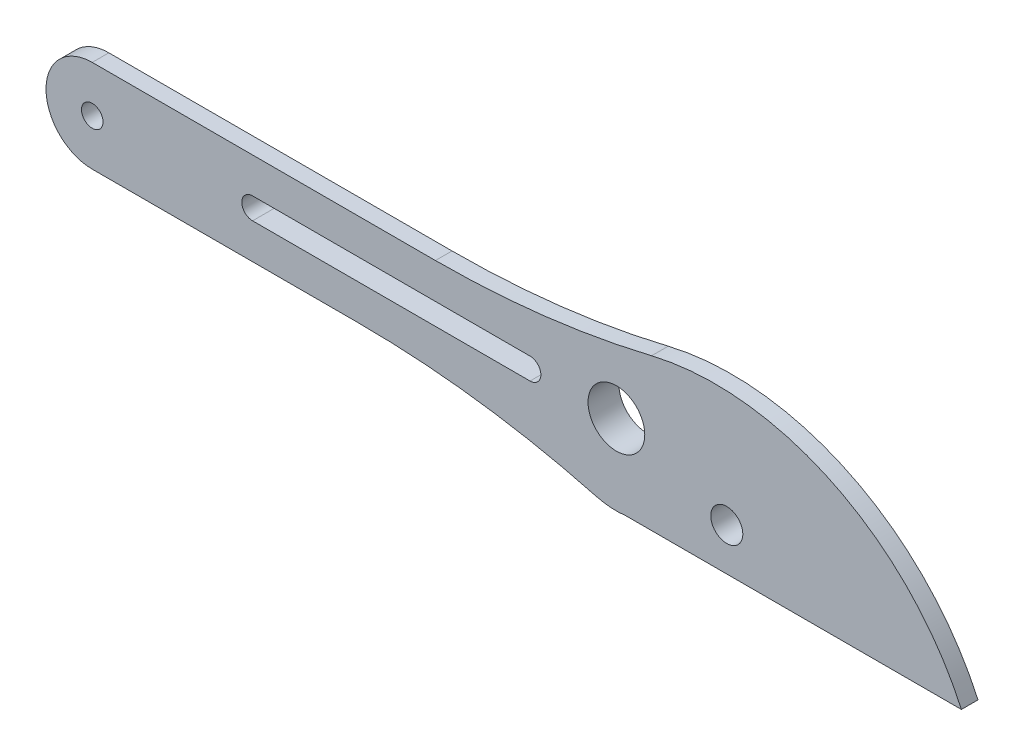
ISO-10303-21;
HEADER;
FILE_DESCRIPTION(('STEP AP214'),'2;1');
FILE_NAME('part.step','',(''),(''),'','','');
FILE_SCHEMA(('AUTOMOTIVE_DESIGN { 1 0 10303 214 1 1 1 1 }'));
ENDSEC;
DATA;
#1=APPLICATION_CONTEXT('core data for automotive mechanical design processes');
#2=APPLICATION_PROTOCOL_DEFINITION('international standard','automotive_design',2000,#1);
#3=PRODUCT_CONTEXT('',#1,'mechanical');
#4=PRODUCT('Part','Part','',(#3));
#5=PRODUCT_RELATED_PRODUCT_CATEGORY('part','',(#4));
#6=PRODUCT_DEFINITION_FORMATION('','',#4);
#7=PRODUCT_DEFINITION_CONTEXT('part definition',#1,'design');
#8=PRODUCT_DEFINITION('design','',#6,#7);
#9=PRODUCT_DEFINITION_SHAPE('','',#8);
#10=(LENGTH_UNIT() NAMED_UNIT(*) SI_UNIT(.MILLI.,.METRE.));
#11=(NAMED_UNIT(*) PLANE_ANGLE_UNIT() SI_UNIT($,.RADIAN.));
#12=(NAMED_UNIT(*) SI_UNIT($,.STERADIAN.) SOLID_ANGLE_UNIT());
#13=UNCERTAINTY_MEASURE_WITH_UNIT(LENGTH_MEASURE(1.E-05),#10,'distance_accuracy_value','');
#14=(GEOMETRIC_REPRESENTATION_CONTEXT(3) GLOBAL_UNCERTAINTY_ASSIGNED_CONTEXT((#13)) GLOBAL_UNIT_ASSIGNED_CONTEXT((#10,
#11,#12)) REPRESENTATION_CONTEXT('',''));
#15=CARTESIAN_POINT('',(0.,0.,0.));
#16=DIRECTION('',(0.,0.,1.));
#17=DIRECTION('',(1.,0.,0.));
#18=AXIS2_PLACEMENT_3D('',#15,#16,#17);
#19=CARTESIAN_POINT('',(0.,-7.5,5.));
#20=DIRECTION('',(0.,1.,0.));
#21=DIRECTION('',(0.,0.,1.));
#22=AXIS2_PLACEMENT_3D('',#19,#20,#21);
#23=PLANE('',#22);
#24=DIRECTION('',(0.,0.,-1.));
#25=VECTOR('',#24,1.);
#26=CARTESIAN_POINT('',(-26.,-7.5,5.));
#27=LINE('',#26,#25);
#28=CARTESIAN_POINT('',(-26.,-7.5,5.));
#29=VERTEX_POINT('',#28);
#30=CARTESIAN_POINT('',(-26.,-7.5,2.30940107675852));
#31=VERTEX_POINT('',#30);
#32=EDGE_CURVE('E231',#29,#31,#27,.T.);
#33=ORIENTED_EDGE('',*,*,#32,.T.);
#34=DIRECTION('',(1.,0.,0.));
#35=VECTOR('',#34,1.);
#36=CARTESIAN_POINT('',(0.,-7.5,2.30940107675852));
#37=LINE('',#36,#35);
#38=CARTESIAN_POINT('',(17.0148835895386,-7.5,2.30940107675852));
#39=VERTEX_POINT('',#38);
#40=EDGE_CURVE('E310',#31,#39,#37,.T.);
#41=ORIENTED_EDGE('',*,*,#40,.T.);
#42=DIRECTION('',(0.,0.,1.));
#43=VECTOR('',#42,1.);
#44=CARTESIAN_POINT('',(17.0148835895386,-7.5,5.));
#45=LINE('',#44,#43);
#46=CARTESIAN_POINT('',(17.0148835895386,-7.5,5.));
#47=VERTEX_POINT('',#46);
#48=EDGE_CURVE('E247',#39,#47,#45,.T.);
#49=ORIENTED_EDGE('',*,*,#48,.T.);
#50=DIRECTION('',(1.,0.,0.));
#51=VECTOR('',#50,1.);
#52=CARTESIAN_POINT('',(0.,-7.5,5.));
#53=LINE('',#52,#51);
#54=EDGE_CURVE('E206',#29,#47,#53,.T.);
#55=ORIENTED_EDGE('',*,*,#54,.F.);
#56=EDGE_LOOP('',(#33,#41,#49,#55));
#57=FACE_BOUND('',#56,.T.);
#58=ADVANCED_FACE('F43',(#57),#23,.F.);
#59=CARTESIAN_POINT('',(0.,7.5,5.));
#60=DIRECTION('',(0.,1.,0.));
#61=DIRECTION('',(0.,0.,1.));
#62=AXIS2_PLACEMENT_3D('',#59,#60,#61);
#63=PLANE('',#62);
#64=DIRECTION('',(0.,0.,1.));
#65=VECTOR('',#64,1.);
#66=CARTESIAN_POINT('',(29.6541070394529,7.5,5.));
#67=LINE('',#66,#65);
#68=CARTESIAN_POINT('',(29.6541070394529,7.5,5.));
#69=VERTEX_POINT('',#68);
#70=CARTESIAN_POINT('',(29.6541070394529,7.5,2.30940107675852));
#71=VERTEX_POINT('',#70);
#72=EDGE_CURVE('E245',#69,#71,#67,.F.);
#73=ORIENTED_EDGE('',*,*,#72,.T.);
#74=DIRECTION('',(-1.,0.,0.));
#75=VECTOR('',#74,1.);
#76=CARTESIAN_POINT('',(-26.,7.5,2.30940107675852));
#77=LINE('',#76,#75);
#78=CARTESIAN_POINT('',(-26.,7.5,2.30940107675852));
#79=VERTEX_POINT('',#78);
#80=EDGE_CURVE('E378',#71,#79,#77,.T.);
#81=ORIENTED_EDGE('',*,*,#80,.T.);
#82=DIRECTION('',(0.,0.,-1.));
#83=VECTOR('',#82,1.);
#84=CARTESIAN_POINT('',(-26.,7.5,5.));
#85=LINE('',#84,#83);
#86=CARTESIAN_POINT('',(-26.,7.5,5.));
#87=VERTEX_POINT('',#86);
#88=EDGE_CURVE('E234',#87,#79,#85,.T.);
#89=ORIENTED_EDGE('',*,*,#88,.F.);
#90=DIRECTION('',(1.,0.,0.));
#91=VECTOR('',#90,1.);
#92=CARTESIAN_POINT('',(0.,7.5,5.));
#93=LINE('',#92,#91);
#94=EDGE_CURVE('E209',#87,#69,#93,.T.);
#95=ORIENTED_EDGE('',*,*,#94,.T.);
#96=EDGE_LOOP('',(#73,#81,#89,#95));
#97=FACE_BOUND('',#96,.T.);
#98=ADVANCED_FACE('F330',(#97),#63,.T.);
#99=CARTESIAN_POINT('',(45.,0.,5.));
#100=DIRECTION('',(0.,0.,-1.));
#101=DIRECTION('',(-1.,0.,0.));
#102=AXIS2_PLACEMENT_3D('',#99,#100,#101);
#103=CYLINDRICAL_SURFACE('',#102,1.75);
#104=CARTESIAN_POINT('',(45.,0.,0.));
#105=DIRECTION('',(0.,0.,1.));
#106=DIRECTION('',(1.,0.,0.));
#107=AXIS2_PLACEMENT_3D('',#104,#105,#106);
#108=CIRCLE('',#107,1.75);
#109=CARTESIAN_POINT('',(45.,-1.75,0.));
#110=VERTEX_POINT('',#109);
#111=CARTESIAN_POINT('',(45.,1.75,0.));
#112=VERTEX_POINT('',#111);
#113=EDGE_CURVE('E220',#110,#112,#108,.T.);
#114=ORIENTED_EDGE('',*,*,#113,.F.);
#115=DIRECTION('',(0.,0.,-1.));
#116=VECTOR('',#115,1.);
#117=CARTESIAN_POINT('',(45.,-1.75,5.));
#118=LINE('',#117,#116);
#119=CARTESIAN_POINT('',(45.,-1.75,5.));
#120=VERTEX_POINT('',#119);
#121=EDGE_CURVE('E235',#120,#110,#118,.T.);
#122=ORIENTED_EDGE('',*,*,#121,.F.);
#123=CARTESIAN_POINT('',(45.,0.,5.));
#124=DIRECTION('',(0.,0.,1.));
#125=DIRECTION('',(1.,0.,0.));
#126=AXIS2_PLACEMENT_3D('',#123,#124,#125);
#127=CIRCLE('',#126,1.75);
#128=CARTESIAN_POINT('',(45.,1.75,5.));
#129=VERTEX_POINT('',#128);
#130=EDGE_CURVE('E195',#120,#129,#127,.T.);
#131=ORIENTED_EDGE('',*,*,#130,.T.);
#132=DIRECTION('',(0.,0.,-1.));
#133=VECTOR('',#132,1.);
#134=CARTESIAN_POINT('',(45.,1.75,5.));
#135=LINE('',#134,#133);
#136=EDGE_CURVE('E214',#129,#112,#135,.T.);
#137=ORIENTED_EDGE('',*,*,#136,.T.);
#138=EDGE_LOOP('',(#114,#122,#131,#137));
#139=FACE_BOUND('',#138,.T.);
#140=ADVANCED_FACE('F333',(#139),#103,.F.);
#141=CARTESIAN_POINT('',(0.,-1.75,5.));
#142=DIRECTION('',(0.,1.,0.));
#143=DIRECTION('',(-1.,0.,0.));
#144=AXIS2_PLACEMENT_3D('',#141,#142,#143);
#145=PLANE('',#144);
#146=DIRECTION('',(1.,0.,0.));
#147=VECTOR('',#146,1.);
#148=CARTESIAN_POINT('',(0.,-1.75,0.));
#149=LINE('',#148,#147);
#150=CARTESIAN_POINT('',(0.,-1.75,0.));
#151=VERTEX_POINT('',#150);
#152=EDGE_CURVE('E223',#151,#110,#149,.T.);
#153=ORIENTED_EDGE('',*,*,#152,.F.);
#154=DIRECTION('',(0.,0.,-1.));
#155=VECTOR('',#154,1.);
#156=CARTESIAN_POINT('',(0.,-1.75,5.));
#157=LINE('',#156,#155);
#158=CARTESIAN_POINT('',(0.,-1.75,5.));
#159=VERTEX_POINT('',#158);
#160=EDGE_CURVE('E241',#159,#151,#157,.T.);
#161=ORIENTED_EDGE('',*,*,#160,.F.);
#162=DIRECTION('',(1.,0.,0.));
#163=VECTOR('',#162,1.);
#164=CARTESIAN_POINT('',(0.,-1.75,5.));
#165=LINE('',#164,#163);
#166=EDGE_CURVE('E198',#159,#120,#165,.T.);
#167=ORIENTED_EDGE('',*,*,#166,.T.);
#168=ORIENTED_EDGE('',*,*,#121,.T.);
#169=EDGE_LOOP('',(#153,#161,#167,#168));
#170=FACE_BOUND('',#169,.T.);
#171=ADVANCED_FACE('F346',(#170),#145,.T.);
#172=CARTESIAN_POINT('',(0.,0.,5.));
#173=DIRECTION('',(0.,0.,-1.));
#174=DIRECTION('',(-1.,0.,0.));
#175=AXIS2_PLACEMENT_3D('',#172,#173,#174);
#176=CYLINDRICAL_SURFACE('',#175,1.75);
#177=CARTESIAN_POINT('',(0.,0.,0.));
#178=DIRECTION('',(0.,0.,1.));
#179=DIRECTION('',(1.,0.,0.));
#180=AXIS2_PLACEMENT_3D('',#177,#178,#179);
#181=CIRCLE('',#180,1.75);
#182=CARTESIAN_POINT('',(0.,1.75,0.));
#183=VERTEX_POINT('',#182);
#184=EDGE_CURVE('E226',#183,#151,#181,.T.);
#185=ORIENTED_EDGE('',*,*,#184,.F.);
#186=DIRECTION('',(0.,0.,-1.));
#187=VECTOR('',#186,1.);
#188=CARTESIAN_POINT('',(0.,1.75,5.));
#189=LINE('',#188,#187);
#190=CARTESIAN_POINT('',(0.,1.75,5.));
#191=VERTEX_POINT('',#190);
#192=EDGE_CURVE('E239',#191,#183,#189,.T.);
#193=ORIENTED_EDGE('',*,*,#192,.F.);
#194=CARTESIAN_POINT('',(0.,0.,5.));
#195=DIRECTION('',(0.,0.,1.));
#196=DIRECTION('',(1.,0.,0.));
#197=AXIS2_PLACEMENT_3D('',#194,#195,#196);
#198=CIRCLE('',#197,1.75);
#199=EDGE_CURVE('E201',#191,#159,#198,.T.);
#200=ORIENTED_EDGE('',*,*,#199,.T.);
#201=ORIENTED_EDGE('',*,*,#160,.T.);
#202=EDGE_LOOP('',(#185,#193,#200,#201));
#203=FACE_BOUND('',#202,.T.);
#204=ADVANCED_FACE('F342',(#203),#176,.F.);
#205=CARTESIAN_POINT('',(0.,1.75,5.));
#206=DIRECTION('',(0.,1.,0.));
#207=DIRECTION('',(-1.,0.,0.));
#208=AXIS2_PLACEMENT_3D('',#205,#206,#207);
#209=PLANE('',#208);
#210=DIRECTION('',(1.,0.,0.));
#211=VECTOR('',#210,1.);
#212=CARTESIAN_POINT('',(0.,1.75,0.));
#213=LINE('',#212,#211);
#214=EDGE_CURVE('E192',#183,#112,#213,.T.);
#215=ORIENTED_EDGE('',*,*,#214,.T.);
#216=ORIENTED_EDGE('',*,*,#136,.F.);
#217=DIRECTION('',(1.,0.,0.));
#218=VECTOR('',#217,1.);
#219=CARTESIAN_POINT('',(0.,1.75,5.));
#220=LINE('',#219,#218);
#221=EDGE_CURVE('E204',#191,#129,#220,.T.);
#222=ORIENTED_EDGE('',*,*,#221,.F.);
#223=ORIENTED_EDGE('',*,*,#192,.T.);
#224=EDGE_LOOP('',(#215,#216,#222,#223));
#225=FACE_BOUND('',#224,.T.);
#226=ADVANCED_FACE('F338',(#225),#209,.F.);
#227=CARTESIAN_POINT('',(-26.,0.,5.));
#228=DIRECTION('',(0.,0.,-1.));
#229=DIRECTION('',(-1.,0.,0.));
#230=AXIS2_PLACEMENT_3D('',#227,#228,#229);
#231=CYLINDRICAL_SURFACE('',#230,1.75);
#232=CARTESIAN_POINT('',(-26.,0.,5.));
#233=DIRECTION('',(0.,0.,1.));
#234=DIRECTION('',(1.,0.,0.));
#235=AXIS2_PLACEMENT_3D('',#232,#233,#234);
#236=CIRCLE('',#235,1.75);
#237=CARTESIAN_POINT('',(-24.25,0.,5.));
#238=VERTEX_POINT('',#237);
#239=EDGE_CURVE('E191',#238,#238,#236,.T.);
#240=ORIENTED_EDGE('',*,*,#239,.T.);
#241=EDGE_LOOP('',(#240));
#242=FACE_BOUND('',#241,.T.);
#243=CARTESIAN_POINT('',(-26.,0.,0.));
#244=DIRECTION('',(0.,0.,1.));
#245=DIRECTION('',(1.,0.,0.));
#246=AXIS2_PLACEMENT_3D('',#243,#244,#245);
#247=CIRCLE('',#246,1.75);
#248=CARTESIAN_POINT('',(-24.25,0.,0.));
#249=VERTEX_POINT('',#248);
#250=EDGE_CURVE('E217',#249,#249,#247,.T.);
#251=ORIENTED_EDGE('',*,*,#250,.F.);
#252=EDGE_LOOP('',(#251));
#253=FACE_BOUND('',#252,.T.);
#254=ADVANCED_FACE('F341',(#242,#253),#231,.F.);
#255=CARTESIAN_POINT('',(59.,1.49186218934005E-13,5.));
#256=DIRECTION('',(0.,0.,-1.));
#257=DIRECTION('',(-1.,0.,0.));
#258=AXIS2_PLACEMENT_3D('',#255,#256,#257);
#259=CYLINDRICAL_SURFACE('',#258,4.6);
#260=CARTESIAN_POINT('',(59.,1.49186218934005E-13,5.));
#261=DIRECTION('',(0.,0.,1.));
#262=DIRECTION('',(1.,0.,0.));
#263=AXIS2_PLACEMENT_3D('',#260,#261,#262);
#264=CIRCLE('',#263,4.6);
#265=CARTESIAN_POINT('',(63.6,1.49186218934005E-13,5.));
#266=VERTEX_POINT('',#265);
#267=EDGE_CURVE('E188',#266,#266,#264,.T.);
#268=ORIENTED_EDGE('',*,*,#267,.T.);
#269=EDGE_LOOP('',(#268));
#270=FACE_BOUND('',#269,.T.);
#271=CARTESIAN_POINT('',(59.,1.49186218934005E-13,0.));
#272=DIRECTION('',(0.,0.,1.));
#273=DIRECTION('',(1.,0.,0.));
#274=AXIS2_PLACEMENT_3D('',#271,#272,#273);
#275=CIRCLE('',#274,4.6);
#276=CARTESIAN_POINT('',(63.6,1.49186218934005E-13,0.));
#277=VERTEX_POINT('',#276);
#278=EDGE_CURVE('E185',#277,#277,#275,.T.);
#279=ORIENTED_EDGE('',*,*,#278,.F.);
#280=EDGE_LOOP('',(#279));
#281=FACE_BOUND('',#280,.T.);
#282=ADVANCED_FACE('F328',(#270,#281),#259,.F.);
#283=CARTESIAN_POINT('',(-26.,0.,5.));
#284=DIRECTION('',(0.,0.,-1.));
#285=DIRECTION('',(-1.,0.,0.));
#286=AXIS2_PLACEMENT_3D('',#283,#284,#285);
#287=CYLINDRICAL_SURFACE('',#286,7.5);
#288=ORIENTED_EDGE('',*,*,#88,.T.);
#289=CARTESIAN_POINT('',(-26.,0.,2.30940107675852));
#290=DIRECTION('',(0.,0.,1.));
#291=DIRECTION('',(1.,0.,0.));
#292=AXIS2_PLACEMENT_3D('',#289,#290,#291);
#293=CIRCLE('',#292,7.5);
#294=EDGE_CURVE('E380',#79,#31,#293,.T.);
#295=ORIENTED_EDGE('',*,*,#294,.T.);
#296=ORIENTED_EDGE('',*,*,#32,.F.);
#297=CARTESIAN_POINT('',(-26.,0.,5.));
#298=DIRECTION('',(0.,0.,1.));
#299=DIRECTION('',(1.,0.,0.));
#300=AXIS2_PLACEMENT_3D('',#297,#298,#299);
#301=CIRCLE('',#300,7.5);
#302=EDGE_CURVE('E212',#87,#29,#301,.T.);
#303=ORIENTED_EDGE('',*,*,#302,.F.);
#304=EDGE_LOOP('',(#288,#295,#296,#303));
#305=FACE_BOUND('',#304,.T.);
#306=ADVANCED_FACE('F321',(#305),#287,.T.);
#307=CARTESIAN_POINT('',(0.,0.,5.));
#308=DIRECTION('',(0.,0.,1.));
#309=DIRECTION('',(1.,0.,0.));
#310=AXIS2_PLACEMENT_3D('',#307,#308,#309);
#311=PLANE('',#310);
#312=CARTESIAN_POINT('',(76.9012349028732,-6.01566702235068,5.));
#313=DIRECTION('',(0.,0.,1.));
#314=DIRECTION('',(1.,0.,0.));
#315=AXIS2_PLACEMENT_3D('',#312,#313,#314);
#316=CIRCLE('',#315,2.6);
#317=CARTESIAN_POINT('',(79.5012349028732,-6.01566702235068,5.));
#318=VERTEX_POINT('',#317);
#319=EDGE_CURVE('E644',#318,#318,#316,.T.);
#320=ORIENTED_EDGE('',*,*,#319,.F.);
#321=EDGE_LOOP('',(#320));
#322=FACE_BOUND('',#321,.T.);
#323=CARTESIAN_POINT('',(74.9724762389655,-31.0217197370701,5.));
#324=DIRECTION('',(0.,0.,1.));
#325=DIRECTION('',(1.,0.,0.));
#326=AXIS2_PLACEMENT_3D('',#323,#324,#325);
#327=CIRCLE('',#326,43.8922210908054);
#328=CARTESIAN_POINT('',(64.7135609034803,11.6547577232767,5.));
#329=VERTEX_POINT('',#328);
#330=CARTESIAN_POINT('',(114.951362988319,-12.9049957902159,5.));
#331=VERTEX_POINT('',#330);
#332=EDGE_CURVE('E167',#329,#331,#327,.F.);
#333=ORIENTED_EDGE('',*,*,#332,.F.);
#334=CARTESIAN_POINT('',(29.6541070394529,157.5,5.));
#335=DIRECTION('',(0.,0.,1.));
#336=DIRECTION('',(1.,0.,0.));
#337=AXIS2_PLACEMENT_3D('',#334,#335,#336);
#338=CIRCLE('',#337,150.);
#339=EDGE_CURVE('E252',#329,#69,#338,.F.);
#340=ORIENTED_EDGE('',*,*,#339,.T.);
#341=ORIENTED_EDGE('',*,*,#94,.F.);
#342=ORIENTED_EDGE('',*,*,#302,.T.);
#343=ORIENTED_EDGE('',*,*,#54,.T.);
#344=CARTESIAN_POINT('',(17.0148835895386,-157.5,5.));
#345=DIRECTION('',(0.,0.,1.));
#346=DIRECTION('',(1.,0.,0.));
#347=AXIS2_PLACEMENT_3D('',#344,#345,#346);
#348=CIRCLE('',#347,150.);
#349=CARTESIAN_POINT('',(55.6514937832147,-12.5613496932515,5.));
#350=VERTEX_POINT('',#349);
#351=EDGE_CURVE('E254',#47,#350,#348,.F.);
#352=ORIENTED_EDGE('',*,*,#351,.T.);
#353=CARTESIAN_POINT('',(59.,0.,5.));
#354=DIRECTION('',(0.,0.,1.));
#355=DIRECTION('',(1.,0.,0.));
#356=AXIS2_PLACEMENT_3D('',#353,#354,#355);
#357=CIRCLE('',#356,13.);
#358=CARTESIAN_POINT('',(60.568784132539,-12.904995790216,5.));
#359=VERTEX_POINT('',#358);
#360=EDGE_CURVE('E177',#350,#359,#357,.T.);
#361=ORIENTED_EDGE('',*,*,#360,.T.);
#362=DIRECTION('',(-1.,0.,0.));
#363=VECTOR('',#362,1.);
#364=CARTESIAN_POINT('',(0.,-12.9049957902159,5.));
#365=LINE('',#364,#363);
#366=EDGE_CURVE('E160',#331,#359,#365,.T.);
#367=ORIENTED_EDGE('',*,*,#366,.F.);
#368=EDGE_LOOP('',(#333,#340,#341,#342,#343,#352,#361,#367));
#369=FACE_BOUND('',#368,.T.);
#370=ORIENTED_EDGE('',*,*,#239,.F.);
#371=EDGE_LOOP('',(#370));
#372=FACE_BOUND('',#371,.T.);
#373=ORIENTED_EDGE('',*,*,#130,.F.);
#374=ORIENTED_EDGE('',*,*,#166,.F.);
#375=ORIENTED_EDGE('',*,*,#199,.F.);
#376=ORIENTED_EDGE('',*,*,#221,.T.);
#377=EDGE_LOOP('',(#373,#374,#375,#376));
#378=FACE_BOUND('',#377,.T.);
#379=ORIENTED_EDGE('',*,*,#267,.F.);
#380=EDGE_LOOP('',(#379));
#381=FACE_BOUND('',#380,.T.);
#382=ADVANCED_FACE('F174',(#322,#369,#372,#378,#381),#311,.T.);
#383=CARTESIAN_POINT('',(0.,0.,0.));
#384=DIRECTION('',(0.,0.,1.));
#385=DIRECTION('',(1.,0.,0.));
#386=AXIS2_PLACEMENT_3D('',#383,#384,#385);
#387=PLANE('',#386);
#388=CARTESIAN_POINT('',(76.9012349028732,-6.01566702235068,0.));
#389=DIRECTION('',(0.,0.,1.));
#390=DIRECTION('',(1.,0.,0.));
#391=AXIS2_PLACEMENT_3D('',#388,#389,#390);
#392=CIRCLE('',#391,2.6);
#393=CARTESIAN_POINT('',(79.5012349028732,-6.01566702235068,0.));
#394=VERTEX_POINT('',#393);
#395=EDGE_CURVE('E183',#394,#394,#392,.F.);
#396=ORIENTED_EDGE('',*,*,#395,.F.);
#397=EDGE_LOOP('',(#396));
#398=FACE_BOUND('',#397,.T.);
#399=DIRECTION('',(1.,0.,0.));
#400=VECTOR('',#399,1.);
#401=CARTESIAN_POINT('',(0.,-12.9049957902159,0.));
#402=LINE('',#401,#400);
#403=CARTESIAN_POINT('',(70.0081355898879,-12.9049957902159,0.));
#404=VERTEX_POINT('',#403);
#405=CARTESIAN_POINT('',(110.513630088991,-12.9049957902159,0.));
#406=VERTEX_POINT('',#405);
#407=EDGE_CURVE('E164',#404,#406,#402,.T.);
#408=ORIENTED_EDGE('',*,*,#407,.F.);
#409=CARTESIAN_POINT('',(17.0148835895386,-157.5,0.));
#410=DIRECTION('',(0.,0.,1.));
#411=DIRECTION('',(1.,0.,0.));
#412=AXIS2_PLACEMENT_3D('',#409,#410,#411);
#413=CIRCLE('',#412,154.);
#414=CARTESIAN_POINT('',(17.0148835895386,-3.49999999999994,0.));
#415=VERTEX_POINT('',#414);
#416=EDGE_CURVE('E266',#404,#415,#413,.T.);
#417=ORIENTED_EDGE('',*,*,#416,.T.);
#418=DIRECTION('',(-1.,0.,0.));
#419=VECTOR('',#418,1.);
#420=CARTESIAN_POINT('',(0.,-3.49999999999994,0.));
#421=LINE('',#420,#419);
#422=CARTESIAN_POINT('',(-26.,-3.49999999999994,0.));
#423=VERTEX_POINT('',#422);
#424=EDGE_CURVE('E264',#415,#423,#421,.T.);
#425=ORIENTED_EDGE('',*,*,#424,.T.);
#426=CARTESIAN_POINT('',(-26.,0.,0.));
#427=DIRECTION('',(0.,0.,1.));
#428=DIRECTION('',(1.,0.,0.));
#429=AXIS2_PLACEMENT_3D('',#426,#427,#428);
#430=CIRCLE('',#429,3.49999999999994);
#431=CARTESIAN_POINT('',(-26.,3.49999999999994,0.));
#432=VERTEX_POINT('',#431);
#433=EDGE_CURVE('E262',#423,#432,#430,.F.);
#434=ORIENTED_EDGE('',*,*,#433,.T.);
#435=DIRECTION('',(1.,0.,0.));
#436=VECTOR('',#435,1.);
#437=CARTESIAN_POINT('',(29.6541070394529,3.49999999999994,0.));
#438=LINE('',#437,#436);
#439=CARTESIAN_POINT('',(29.6541070394529,3.49999999999997,0.));
#440=VERTEX_POINT('',#439);
#441=EDGE_CURVE('E260',#432,#440,#438,.T.);
#442=ORIENTED_EDGE('',*,*,#441,.T.);
#443=CARTESIAN_POINT('',(29.6541070394529,157.5,0.));
#444=DIRECTION('',(0.,0.,1.));
#445=DIRECTION('',(1.,0.,0.));
#446=AXIS2_PLACEMENT_3D('',#443,#444,#445);
#447=CIRCLE('',#446,154.);
#448=CARTESIAN_POINT('',(65.6484796731877,7.76555126256397,0.));
#449=VERTEX_POINT('',#448);
#450=EDGE_CURVE('E258',#440,#449,#447,.T.);
#451=ORIENTED_EDGE('',*,*,#450,.T.);
#452=CARTESIAN_POINT('',(74.9724762389655,-31.0217197370701,0.));
#453=DIRECTION('',(0.,0.,1.));
#454=DIRECTION('',(1.,0.,0.));
#455=AXIS2_PLACEMENT_3D('',#452,#453,#454);
#456=CIRCLE('',#455,39.8922210908053);
#457=EDGE_CURVE('E256',#449,#406,#456,.F.);
#458=ORIENTED_EDGE('',*,*,#457,.T.);
#459=EDGE_LOOP('',(#408,#417,#425,#434,#442,#451,#458));
#460=FACE_BOUND('',#459,.T.);
#461=ORIENTED_EDGE('',*,*,#250,.T.);
#462=EDGE_LOOP('',(#461));
#463=FACE_BOUND('',#462,.T.);
#464=ORIENTED_EDGE('',*,*,#113,.T.);
#465=ORIENTED_EDGE('',*,*,#214,.F.);
#466=ORIENTED_EDGE('',*,*,#184,.T.);
#467=ORIENTED_EDGE('',*,*,#152,.T.);
#468=EDGE_LOOP('',(#464,#465,#466,#467));
#469=FACE_BOUND('',#468,.T.);
#470=ORIENTED_EDGE('',*,*,#278,.T.);
#471=EDGE_LOOP('',(#470));
#472=FACE_BOUND('',#471,.T.);
#473=ADVANCED_FACE('F318',(#398,#460,#463,#469,#472),#387,.F.);
#474=CARTESIAN_POINT('',(74.9724762389655,-31.0217197370701,-71.4199801213994));
#475=DIRECTION('',(0.,0.,1.));
#476=DIRECTION('',(1.,0.,0.));
#477=AXIS2_PLACEMENT_3D('',#474,#475,#476);
#478=CYLINDRICAL_SURFACE('',#477,43.8922210908054);
#479=DIRECTION('',(0.,0.,1.));
#480=VECTOR('',#479,1.);
#481=CARTESIAN_POINT('',(114.951362988319,-12.9049957902159,-71.4199801213994));
#482=LINE('',#481,#480);
#483=CARTESIAN_POINT('',(114.951362988319,-12.9049957902159,2.30940107675852));
#484=VERTEX_POINT('',#483);
#485=EDGE_CURVE('E155',#484,#331,#482,.T.);
#486=ORIENTED_EDGE('',*,*,#485,.F.);
#487=CARTESIAN_POINT('',(74.9724762389655,-31.0217197370701,2.30940107675852));
#488=DIRECTION('',(0.,0.,1.));
#489=DIRECTION('',(1.,0.,0.));
#490=AXIS2_PLACEMENT_3D('',#487,#488,#489);
#491=CIRCLE('',#490,43.8922210908054);
#492=CARTESIAN_POINT('',(64.7135609034803,11.6547577232767,2.30940107675852));
#493=VERTEX_POINT('',#492);
#494=EDGE_CURVE('E11',#484,#493,#491,.T.);
#495=ORIENTED_EDGE('',*,*,#494,.T.);
#496=DIRECTION('',(0.,0.,1.));
#497=VECTOR('',#496,1.);
#498=CARTESIAN_POINT('',(64.7135609034803,11.6547577232767,-71.4199801213994));
#499=LINE('',#498,#497);
#500=EDGE_CURVE('E169',#493,#329,#499,.T.);
#501=ORIENTED_EDGE('',*,*,#500,.T.);
#502=ORIENTED_EDGE('',*,*,#332,.T.);
#503=EDGE_LOOP('',(#486,#495,#501,#502));
#504=FACE_BOUND('',#503,.T.);
#505=ADVANCED_FACE('F168',(#504),#478,.T.);
#506=CARTESIAN_POINT('',(0.,-12.9049957902159,-71.4199801213994));
#507=DIRECTION('',(0.,1.,0.));
#508=DIRECTION('',(-1.,0.,0.));
#509=AXIS2_PLACEMENT_3D('',#506,#507,#508);
#510=PLANE('',#509);
#511=DIRECTION('',(0.,0.,1.));
#512=VECTOR('',#511,1.);
#513=CARTESIAN_POINT('',(60.568784132539,-12.904995790216,-71.4199801213994));
#514=LINE('',#513,#512);
#515=CARTESIAN_POINT('',(60.568784132539,-12.904995790216,1.72505885057921));
#516=VERTEX_POINT('',#515);
#517=EDGE_CURVE('E178',#516,#359,#514,.T.);
#518=ORIENTED_EDGE('',*,*,#517,.F.);
#519=CARTESIAN_POINT('',(60.568784132539,-12.904995790216,1.7250588505792));
#520=CARTESIAN_POINT('',(61.3576210518911,-12.9049957902159,1.59370574340599));
#521=CARTESIAN_POINT('',(62.1459267757085,-12.9049957902159,1.45916843871799));
#522=CARTESIAN_POINT('',(63.7213994067404,-12.9049957902159,1.18385724750749));
#523=CARTESIAN_POINT('',(64.508566380001,-12.9049957902159,1.04308373898946));
#524=CARTESIAN_POINT('',(66.0817792060391,-12.9049957902159,0.755416274518698));
#525=CARTESIAN_POINT('',(66.8678250607877,-12.9049957902159,0.608522329340795));
#526=CARTESIAN_POINT('',(68.4388205210886,-12.9049957902159,0.30873071781798));
#527=CARTESIAN_POINT('',(69.2237700573982,-12.9049957902159,0.15583268857281));
#528=CARTESIAN_POINT('',(70.0081355898879,-12.9049957902159,0.));
#529=B_SPLINE_CURVE_WITH_KNOTS('',3,(#519,#520,#521,#522,#523,#524,#525,#526,#527,#528),
.UNSPECIFIED.,.F.,.F.,(4,2,2,2,4),(0.,2.39908690980366,4.79802859856018,7.19696606423729,
9.59604875091138),.UNSPECIFIED.);
#530=EDGE_CURVE('E304',#516,#404,#529,.T.);
#531=ORIENTED_EDGE('',*,*,#530,.T.);
#532=ORIENTED_EDGE('',*,*,#407,.T.);
#533=CARTESIAN_POINT('',(110.513630088991,-12.9049957902159,0.));
#534=CARTESIAN_POINT('',(110.884353152364,-12.9049957902159,0.19069339096048));
#535=CARTESIAN_POINT('',(111.254826944924,-12.9049957902159,0.381870948476481));
#536=CARTESIAN_POINT('',(111.995306925248,-12.9049957902159,0.765124959750751));
#537=CARTESIAN_POINT('',(112.365313115388,-12.9049957902159,0.957201408921546));
#538=CARTESIAN_POINT('',(113.104892356296,-12.9049957902159,1.34218558187779));
#539=CARTESIAN_POINT('',(113.474465407359,-12.9049957902159,1.53509330509987));
#540=CARTESIAN_POINT('',(114.213209214779,-12.9049957902159,1.9216821401831));
#541=CARTESIAN_POINT('',(114.582379969077,-12.9049957902159,2.11536325598107));
#542=CARTESIAN_POINT('',(114.951362988319,-12.9049957902159,2.30940107675852));
#543=B_SPLINE_CURVE_WITH_KNOTS('',3,(#533,#534,#535,#536,#537,#538,#539,#540,#541,#542),
.UNSPECIFIED.,.F.,.F.,(4,2,2,2,4),(0.,1.2506775860613,2.50134879626307,3.75201915898992,
5.002695896153),.UNSPECIFIED.);
#544=EDGE_CURVE('E163',#406,#484,#543,.T.);
#545=ORIENTED_EDGE('',*,*,#544,.T.);
#546=ORIENTED_EDGE('',*,*,#485,.T.);
#547=ORIENTED_EDGE('',*,*,#366,.T.);
#548=EDGE_LOOP('',(#518,#531,#532,#545,#546,#547));
#549=FACE_BOUND('',#548,.T.);
#550=ADVANCED_FACE('F158',(#549),#510,.F.);
#551=CARTESIAN_POINT('',(59.,0.,-71.4199801213994));
#552=DIRECTION('',(0.,0.,1.));
#553=DIRECTION('',(1.,0.,0.));
#554=AXIS2_PLACEMENT_3D('',#551,#552,#553);
#555=CYLINDRICAL_SURFACE('',#554,13.);
#556=DIRECTION('',(0.,0.,1.));
#557=VECTOR('',#556,1.);
#558=CARTESIAN_POINT('',(55.6514937832147,-12.5613496932515,-71.4199801213994));
#559=LINE('',#558,#557);
#560=CARTESIAN_POINT('',(55.6514937832147,-12.5613496932515,2.30940107675852));
#561=VERTEX_POINT('',#560);
#562=EDGE_CURVE('E249',#350,#561,#559,.F.);
#563=ORIENTED_EDGE('',*,*,#562,.T.);
#564=CARTESIAN_POINT('',(55.6514937832147,-12.5613496932515,2.30940107675852));
#565=CARTESIAN_POINT('',(55.8068547212045,-12.6027656868393,2.30940193137791));
#566=CARTESIAN_POINT('',(55.9629637838939,-12.6412910827093,2.3075291466566));
#567=CARTESIAN_POINT('',(56.2764154781214,-12.7125103820226,2.30004992363123));
#568=CARTESIAN_POINT('',(56.4337580916543,-12.7452043704177,2.29444353972375));
#569=CARTESIAN_POINT('',(56.9072227567297,-12.8344605040271,2.27204558928696));
#570=CARTESIAN_POINT('',(57.2248076285835,-12.8822037409639,2.2496752195989));
#571=CARTESIAN_POINT('',(57.8555173143151,-12.953344022971,2.19093925354832));
#572=CARTESIAN_POINT('',(58.1686199065292,-12.9771625461105,2.15483197920002));
#573=CARTESIAN_POINT('',(58.793749677075,-13.0021238794962,2.06913789688408));
#574=CARTESIAN_POINT('',(59.1057773183159,-13.0032781251876,2.01955789949201));
#575=CARTESIAN_POINT('',(59.6092752287843,-12.9871520660065,1.9287789059707));
#576=CARTESIAN_POINT('',(59.801710253121,-12.9766784726086,1.89150167358733));
#577=CARTESIAN_POINT('',(60.1860424668695,-12.9472263345825,1.81195922125599));
#578=CARTESIAN_POINT('',(60.3779303479952,-12.9281996814569,1.76966679693508));
#579=CARTESIAN_POINT('',(60.568784132539,-12.9049957902161,1.72505885057925));
#580=B_SPLINE_CURVE_WITH_KNOTS('',3,(#564,#565,#566,#567,#568,#569,#570,#571,#572,#573,#574,
#575,#576,#577,#578,#579),.UNSPECIFIED.,.F.,.F.,(4,2,2,2,2,2,2,4),(0.,0.482277941911714,
0.964548857443253,1.92901026079775,2.87616610549932,3.82284404274501,4.41149580915753,
5.00350082418514),.UNSPECIFIED.);
#581=EDGE_CURVE('E271',#561,#516,#580,.T.);
#582=ORIENTED_EDGE('',*,*,#581,.T.);
#583=ORIENTED_EDGE('',*,*,#517,.T.);
#584=ORIENTED_EDGE('',*,*,#360,.F.);
#585=EDGE_LOOP('',(#563,#582,#583,#584));
#586=FACE_BOUND('',#585,.T.);
#587=ADVANCED_FACE('F285',(#586),#555,.T.);
#588=CARTESIAN_POINT('',(29.6541070394529,157.5,-71.4199801213994));
#589=DIRECTION('',(0.,0.,1.));
#590=DIRECTION('',(1.,0.,0.));
#591=AXIS2_PLACEMENT_3D('',#588,#589,#590);
#592=CYLINDRICAL_SURFACE('',#591,150.);
#593=ORIENTED_EDGE('',*,*,#500,.F.);
#594=CARTESIAN_POINT('',(29.6541070394529,157.5,2.30940107675852));
#595=DIRECTION('',(0.,0.,1.));
#596=DIRECTION('',(1.,0.,0.));
#597=AXIS2_PLACEMENT_3D('',#594,#595,#596);
#598=CIRCLE('',#597,150.);
#599=EDGE_CURVE('E54',#493,#71,#598,.F.);
#600=ORIENTED_EDGE('',*,*,#599,.T.);
#601=ORIENTED_EDGE('',*,*,#72,.F.);
#602=ORIENTED_EDGE('',*,*,#339,.F.);
#603=EDGE_LOOP('',(#593,#600,#601,#602));
#604=FACE_BOUND('',#603,.T.);
#605=ADVANCED_FACE('F359',(#604),#592,.F.);
#606=CARTESIAN_POINT('',(17.0148835895386,-157.5,-71.4199801213994));
#607=DIRECTION('',(0.,0.,1.));
#608=DIRECTION('',(1.,0.,0.));
#609=AXIS2_PLACEMENT_3D('',#606,#607,#608);
#610=CYLINDRICAL_SURFACE('',#609,150.);
#611=ORIENTED_EDGE('',*,*,#48,.F.);
#612=CARTESIAN_POINT('',(17.0148835895386,-157.5,2.30940107675852));
#613=DIRECTION('',(0.,0.,1.));
#614=DIRECTION('',(1.,0.,0.));
#615=AXIS2_PLACEMENT_3D('',#612,#613,#614);
#616=CIRCLE('',#615,150.);
#617=EDGE_CURVE('E269',#39,#561,#616,.F.);
#618=ORIENTED_EDGE('',*,*,#617,.T.);
#619=ORIENTED_EDGE('',*,*,#562,.F.);
#620=ORIENTED_EDGE('',*,*,#351,.F.);
#621=EDGE_LOOP('',(#611,#618,#619,#620));
#622=FACE_BOUND('',#621,.T.);
#623=ADVANCED_FACE('F300',(#622),#610,.F.);
#624=CARTESIAN_POINT('',(74.9724762389655,-31.0217197370701,2.30940107675852));
#625=DIRECTION('',(0.,0.,1.));
#626=DIRECTION('',(1.,0.,0.));
#627=AXIS2_PLACEMENT_3D('',#624,#625,#626);
#628=CONICAL_SURFACE('',#627,43.8922210908054,1.0471975511966);
#629=ORIENTED_EDGE('',*,*,#544,.F.);
#630=ORIENTED_EDGE('',*,*,#457,.F.);
#631=DIRECTION('',(0.202415851260376,-0.842037898884926,-0.499999999999997));
#632=VECTOR('',#631,1.);
#633=CARTESIAN_POINT('',(64.7135609034803,11.6547577232767,2.30940107675852));
#634=LINE('',#633,#632);
#635=EDGE_CURVE('E49',#493,#449,#634,.T.);
#636=ORIENTED_EDGE('',*,*,#635,.F.);
#637=ORIENTED_EDGE('',*,*,#494,.F.);
#638=EDGE_LOOP('',(#629,#630,#636,#637));
#639=FACE_BOUND('',#638,.T.);
#640=ADVANCED_FACE('F46',(#639),#628,.T.);
#641=CARTESIAN_POINT('',(29.6541070394529,157.5,0.));
#642=DIRECTION('',(0.,0.,-1.));
#643=DIRECTION('',(-1.,0.,0.));
#644=AXIS2_PLACEMENT_3D('',#641,#642,#643);
#645=CONICAL_SURFACE('',#644,154.,1.0471975511966);
#646=ORIENTED_EDGE('',*,*,#635,.T.);
#647=ORIENTED_EDGE('',*,*,#450,.F.);
#648=DIRECTION('',(0.,-0.866025403784439,-0.499999999999999));
#649=VECTOR('',#648,1.);
#650=CARTESIAN_POINT('',(29.6541070394529,7.5,2.30940107675852));
#651=LINE('',#650,#649);
#652=EDGE_CURVE('E373',#71,#440,#651,.T.);
#653=ORIENTED_EDGE('',*,*,#652,.F.);
#654=ORIENTED_EDGE('',*,*,#599,.F.);
#655=EDGE_LOOP('',(#646,#647,#653,#654));
#656=FACE_BOUND('',#655,.T.);
#657=ADVANCED_FACE('F375',(#656),#645,.F.);
#658=CARTESIAN_POINT('',(0.,3.49999999999994,0.));
#659=DIRECTION('',(0.,0.499999999999997,-0.86602540378444));
#660=DIRECTION('',(-1.,0.,0.));
#661=AXIS2_PLACEMENT_3D('',#658,#659,#660);
#662=PLANE('',#661);
#663=ORIENTED_EDGE('',*,*,#652,.T.);
#664=ORIENTED_EDGE('',*,*,#441,.F.);
#665=DIRECTION('',(0.,-0.86602540378444,-0.499999999999997));
#666=VECTOR('',#665,1.);
#667=CARTESIAN_POINT('',(-26.,7.5,2.30940107675852));
#668=LINE('',#667,#666);
#669=EDGE_CURVE('E388',#79,#432,#668,.T.);
#670=ORIENTED_EDGE('',*,*,#669,.F.);
#671=ORIENTED_EDGE('',*,*,#80,.F.);
#672=EDGE_LOOP('',(#663,#664,#670,#671));
#673=FACE_BOUND('',#672,.T.);
#674=ADVANCED_FACE('F392',(#673),#662,.T.);
#675=CARTESIAN_POINT('',(-26.,0.,2.30940107675852));
#676=DIRECTION('',(0.,0.,1.));
#677=DIRECTION('',(1.,0.,0.));
#678=AXIS2_PLACEMENT_3D('',#675,#676,#677);
#679=CONICAL_SURFACE('',#678,7.5,1.0471975511966);
#680=ORIENTED_EDGE('',*,*,#669,.T.);
#681=ORIENTED_EDGE('',*,*,#433,.F.);
#682=DIRECTION('',(0.,0.86602540378444,-0.499999999999997));
#683=VECTOR('',#682,1.);
#684=CARTESIAN_POINT('',(-26.,-7.5,2.30940107675852));
#685=LINE('',#684,#683);
#686=EDGE_CURVE('E385',#31,#423,#685,.T.);
#687=ORIENTED_EDGE('',*,*,#686,.F.);
#688=ORIENTED_EDGE('',*,*,#294,.F.);
#689=EDGE_LOOP('',(#680,#681,#687,#688));
#690=FACE_BOUND('',#689,.T.);
#691=ADVANCED_FACE('F415',(#690),#679,.T.);
#692=CARTESIAN_POINT('',(0.,-7.5,2.30940107675852));
#693=DIRECTION('',(0.,0.499999999999997,0.86602540378444));
#694=DIRECTION('',(1.,0.,0.));
#695=AXIS2_PLACEMENT_3D('',#692,#693,#694);
#696=PLANE('',#695);
#697=ORIENTED_EDGE('',*,*,#686,.T.);
#698=ORIENTED_EDGE('',*,*,#424,.F.);
#699=DIRECTION('',(0.,0.86602540378444,-0.499999999999997));
#700=VECTOR('',#699,1.);
#701=CARTESIAN_POINT('',(17.0148835895386,-7.5,2.30940107675852));
#702=LINE('',#701,#700);
#703=EDGE_CURVE('E383',#39,#415,#702,.T.);
#704=ORIENTED_EDGE('',*,*,#703,.F.);
#705=ORIENTED_EDGE('',*,*,#40,.F.);
#706=EDGE_LOOP('',(#697,#698,#704,#705));
#707=FACE_BOUND('',#706,.T.);
#708=ADVANCED_FACE('F298',(#707),#696,.F.);
#709=CARTESIAN_POINT('',(17.0148835895386,-157.5,0.));
#710=DIRECTION('',(0.,0.,-1.));
#711=DIRECTION('',(-1.,0.,0.));
#712=AXIS2_PLACEMENT_3D('',#709,#710,#711);
#713=CONICAL_SURFACE('',#712,154.,1.0471975511966);
#714=ORIENTED_EDGE('',*,*,#581,.F.);
#715=ORIENTED_EDGE('',*,*,#617,.F.);
#716=ORIENTED_EDGE('',*,*,#703,.T.);
#717=ORIENTED_EDGE('',*,*,#416,.F.);
#718=ORIENTED_EDGE('',*,*,#530,.F.);
#719=EDGE_LOOP('',(#714,#715,#716,#717,#718));
#720=FACE_BOUND('',#719,.T.);
#721=ADVANCED_FACE('F289',(#720),#713,.F.);
#722=CARTESIAN_POINT('',(76.9012349028732,-6.01566702235068,-7.35391052434011));
#723=DIRECTION('',(0.,0.,1.));
#724=DIRECTION('',(1.,0.,0.));
#725=AXIS2_PLACEMENT_3D('',#722,#723,#724);
#726=CYLINDRICAL_SURFACE('',#725,2.6);
#727=ORIENTED_EDGE('',*,*,#395,.T.);
#728=EDGE_LOOP('',(#727));
#729=FACE_BOUND('',#728,.T.);
#730=ORIENTED_EDGE('',*,*,#319,.T.);
#731=EDGE_LOOP('',(#730));
#732=FACE_BOUND('',#731,.T.);
#733=ADVANCED_FACE('F297',(#729,#732),#726,.F.);
#734=CLOSED_SHELL('',(#58,#98,#140,#171,#204,#226,#254,#282,#306,#382,#473,#505,#550,#587,#605,
#623,#640,#657,#674,#691,#708,#721,#733));
#735=MANIFOLD_SOLID_BREP('B2',#734);
#736=ADVANCED_BREP_SHAPE_REPRESENTATION('',(#18,#735),#14);
#737=SHAPE_DEFINITION_REPRESENTATION(#9,#736);
ENDSEC;
END-ISO-10303-21;
